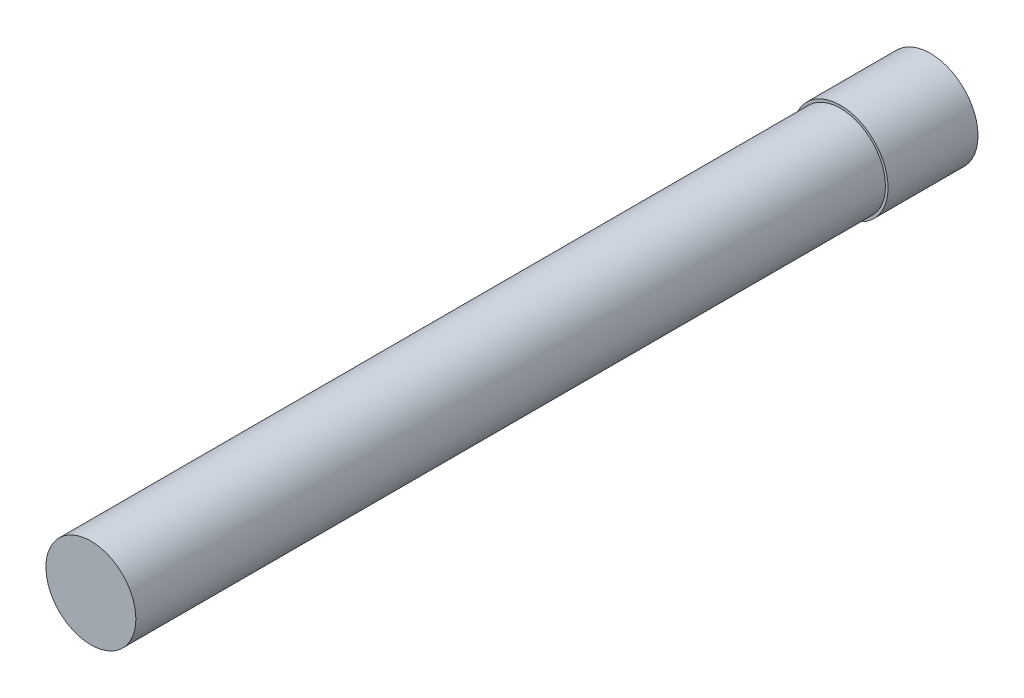
ISO-10303-21;
HEADER;
FILE_DESCRIPTION(('STEP AP214'),'2;1');
FILE_NAME('part.step','',(''),(''),'','','');
FILE_SCHEMA(('AUTOMOTIVE_DESIGN { 1 0 10303 214 1 1 1 1 }'));
ENDSEC;
DATA;
#1=APPLICATION_CONTEXT('core data for automotive mechanical design processes');
#2=APPLICATION_PROTOCOL_DEFINITION('international standard','automotive_design',2000,#1);
#3=PRODUCT_CONTEXT('',#1,'mechanical');
#4=PRODUCT('Part','Part','',(#3));
#5=PRODUCT_RELATED_PRODUCT_CATEGORY('part','',(#4));
#6=PRODUCT_DEFINITION_FORMATION('','',#4);
#7=PRODUCT_DEFINITION_CONTEXT('part definition',#1,'design');
#8=PRODUCT_DEFINITION('design','',#6,#7);
#9=PRODUCT_DEFINITION_SHAPE('','',#8);
#10=(LENGTH_UNIT() NAMED_UNIT(*) SI_UNIT(.MILLI.,.METRE.));
#11=(NAMED_UNIT(*) PLANE_ANGLE_UNIT() SI_UNIT($,.RADIAN.));
#12=(NAMED_UNIT(*) SI_UNIT($,.STERADIAN.) SOLID_ANGLE_UNIT());
#13=UNCERTAINTY_MEASURE_WITH_UNIT(LENGTH_MEASURE(1.E-05),#10,'distance_accuracy_value','');
#14=(GEOMETRIC_REPRESENTATION_CONTEXT(3) GLOBAL_UNCERTAINTY_ASSIGNED_CONTEXT((#13)) GLOBAL_UNIT_ASSIGNED_CONTEXT((#10,
#11,#12)) REPRESENTATION_CONTEXT('',''));
#15=CARTESIAN_POINT('',(0.,0.,0.));
#16=DIRECTION('',(0.,0.,1.));
#17=DIRECTION('',(1.,0.,0.));
#18=AXIS2_PLACEMENT_3D('',#15,#16,#17);
#19=CARTESIAN_POINT('',(0.,0.,6.));
#20=DIRECTION('',(0.,0.,-1.));
#21=DIRECTION('',(-1.,0.,0.));
#22=AXIS2_PLACEMENT_3D('',#19,#20,#21);
#23=CYLINDRICAL_SURFACE('',#22,3.175);
#24=CARTESIAN_POINT('',(0.,0.,6.));
#25=DIRECTION('',(0.,0.,1.));
#26=DIRECTION('',(1.,0.,0.));
#27=AXIS2_PLACEMENT_3D('',#24,#25,#26);
#28=CIRCLE('',#27,3.175);
#29=CARTESIAN_POINT('',(3.175,0.,6.));
#30=VERTEX_POINT('',#29);
#31=EDGE_CURVE('E51',#30,#30,#28,.T.);
#32=ORIENTED_EDGE('',*,*,#31,.F.);
#33=EDGE_LOOP('',(#32));
#34=FACE_BOUND('',#33,.T.);
#35=CARTESIAN_POINT('',(0.,0.,0.));
#36=DIRECTION('',(0.,0.,1.));
#37=DIRECTION('',(1.,0.,0.));
#38=AXIS2_PLACEMENT_3D('',#35,#36,#37);
#39=CIRCLE('',#38,3.175);
#40=CARTESIAN_POINT('',(3.175,0.,0.));
#41=VERTEX_POINT('',#40);
#42=EDGE_CURVE('E46',#41,#41,#39,.T.);
#43=ORIENTED_EDGE('',*,*,#42,.T.);
#44=EDGE_LOOP('',(#43));
#45=FACE_BOUND('',#44,.T.);
#46=ADVANCED_FACE('F43',(#34,#45),#23,.T.);
#47=CARTESIAN_POINT('',(0.,0.,6.));
#48=DIRECTION('',(0.,0.,1.));
#49=DIRECTION('',(1.,0.,0.));
#50=AXIS2_PLACEMENT_3D('',#47,#48,#49);
#51=PLANE('',#50);
#52=CARTESIAN_POINT('',(0.,0.,6.));
#53=DIRECTION('',(0.,0.,1.));
#54=DIRECTION('',(1.,0.,0.));
#55=AXIS2_PLACEMENT_3D('',#52,#53,#54);
#56=CIRCLE('',#55,3.);
#57=CARTESIAN_POINT('',(3.,0.,6.));
#58=VERTEX_POINT('',#57);
#59=EDGE_CURVE('E10',#58,#58,#56,.T.);
#60=ORIENTED_EDGE('',*,*,#59,.F.);
#61=EDGE_LOOP('',(#60));
#62=FACE_BOUND('',#61,.T.);
#63=ORIENTED_EDGE('',*,*,#31,.T.);
#64=EDGE_LOOP('',(#63));
#65=FACE_BOUND('',#64,.T.);
#66=ADVANCED_FACE('F71',(#62,#65),#51,.T.);
#67=CARTESIAN_POINT('',(0.,0.,0.));
#68=DIRECTION('',(0.,0.,1.));
#69=DIRECTION('',(1.,0.,0.));
#70=AXIS2_PLACEMENT_3D('',#67,#68,#69);
#71=PLANE('',#70);
#72=ORIENTED_EDGE('',*,*,#42,.F.);
#73=EDGE_LOOP('',(#72));
#74=FACE_BOUND('',#73,.T.);
#75=ADVANCED_FACE('F68',(#74),#71,.F.);
#76=CARTESIAN_POINT('',(0.,0.,56.));
#77=DIRECTION('',(0.,0.,-1.));
#78=DIRECTION('',(-1.,0.,0.));
#79=AXIS2_PLACEMENT_3D('',#76,#77,#78);
#80=CYLINDRICAL_SURFACE('',#79,3.);
#81=CARTESIAN_POINT('',(0.,0.,56.));
#82=DIRECTION('',(0.,0.,1.));
#83=DIRECTION('',(1.,0.,0.));
#84=AXIS2_PLACEMENT_3D('',#81,#82,#83);
#85=CIRCLE('',#84,3.);
#86=CARTESIAN_POINT('',(3.,0.,56.));
#87=VERTEX_POINT('',#86);
#88=EDGE_CURVE('E58',#87,#87,#85,.T.);
#89=ORIENTED_EDGE('',*,*,#88,.F.);
#90=EDGE_LOOP('',(#89));
#91=FACE_BOUND('',#90,.T.);
#92=ORIENTED_EDGE('',*,*,#59,.T.);
#93=EDGE_LOOP('',(#92));
#94=FACE_BOUND('',#93,.T.);
#95=ADVANCED_FACE('F70',(#91,#94),#80,.T.);
#96=CARTESIAN_POINT('',(0.,0.,56.));
#97=DIRECTION('',(0.,0.,1.));
#98=DIRECTION('',(1.,0.,0.));
#99=AXIS2_PLACEMENT_3D('',#96,#97,#98);
#100=PLANE('',#99);
#101=ORIENTED_EDGE('',*,*,#88,.T.);
#102=EDGE_LOOP('',(#101));
#103=FACE_BOUND('',#102,.T.);
#104=ADVANCED_FACE('F77',(#103),#100,.T.);
#105=CLOSED_SHELL('',(#46,#66,#75,#95,#104));
#106=MANIFOLD_SOLID_BREP('B2',#105);
#107=ADVANCED_BREP_SHAPE_REPRESENTATION('',(#18,#106),#14);
#108=SHAPE_DEFINITION_REPRESENTATION(#9,#107);
ENDSEC;
END-ISO-10303-21;
